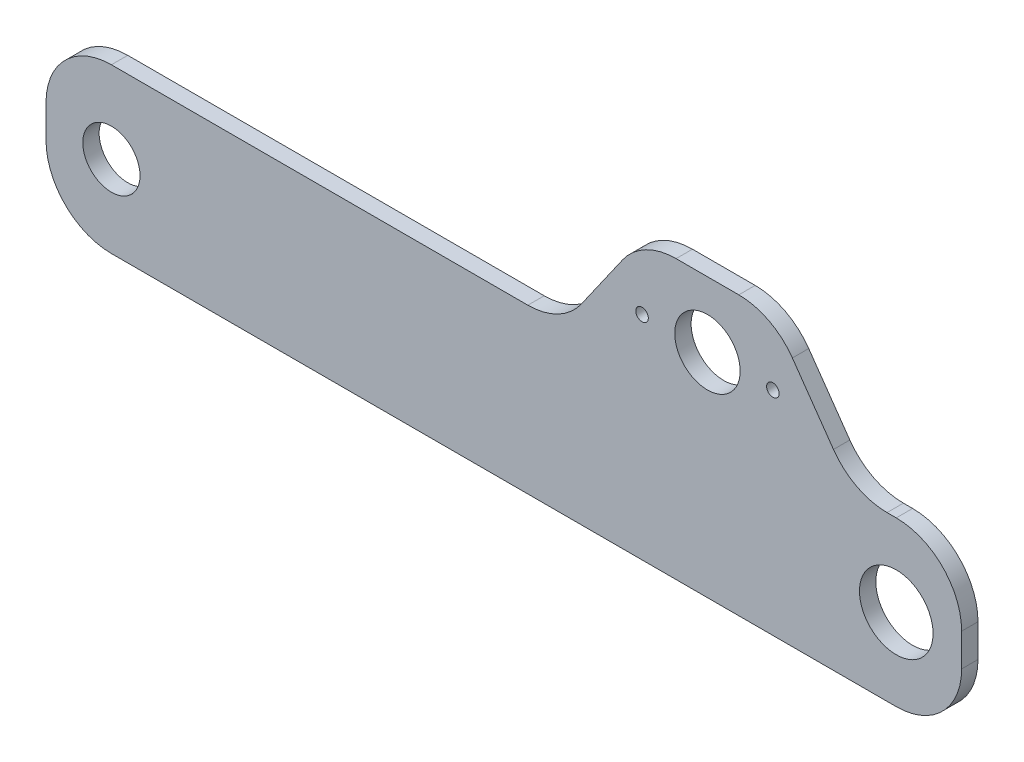
ISO-10303-21;
HEADER;
FILE_DESCRIPTION(('STEP AP214'),'2;1');
FILE_NAME('part.step','',(''),(''),'','','');
FILE_SCHEMA(('AUTOMOTIVE_DESIGN { 1 0 10303 214 1 1 1 1 }'));
ENDSEC;
DATA;
#1=APPLICATION_CONTEXT('core data for automotive mechanical design processes');
#2=APPLICATION_PROTOCOL_DEFINITION('international standard','automotive_design',2000,#1);
#3=PRODUCT_CONTEXT('',#1,'mechanical');
#4=PRODUCT('Part','Part','',(#3));
#5=PRODUCT_RELATED_PRODUCT_CATEGORY('part','',(#4));
#6=PRODUCT_DEFINITION_FORMATION('','',#4);
#7=PRODUCT_DEFINITION_CONTEXT('part definition',#1,'design');
#8=PRODUCT_DEFINITION('design','',#6,#7);
#9=PRODUCT_DEFINITION_SHAPE('','',#8);
#10=(LENGTH_UNIT() NAMED_UNIT(*) SI_UNIT(.MILLI.,.METRE.));
#11=(NAMED_UNIT(*) PLANE_ANGLE_UNIT() SI_UNIT($,.RADIAN.));
#12=(NAMED_UNIT(*) SI_UNIT($,.STERADIAN.) SOLID_ANGLE_UNIT());
#13=UNCERTAINTY_MEASURE_WITH_UNIT(LENGTH_MEASURE(1.E-05),#10,'distance_accuracy_value','');
#14=(GEOMETRIC_REPRESENTATION_CONTEXT(3) GLOBAL_UNCERTAINTY_ASSIGNED_CONTEXT((#13)) GLOBAL_UNIT_ASSIGNED_CONTEXT((#10,
#11,#12)) REPRESENTATION_CONTEXT('',''));
#15=CARTESIAN_POINT('',(0.,0.,0.));
#16=DIRECTION('',(0.,0.,1.));
#17=DIRECTION('',(1.,0.,0.));
#18=AXIS2_PLACEMENT_3D('',#15,#16,#17);
#19=CARTESIAN_POINT('',(341.76482123998,69.8499999999999,6.35));
#20=DIRECTION('',(0.,0.,1.));
#21=DIRECTION('',(1.,0.,0.));
#22=AXIS2_PLACEMENT_3D('',#19,#20,#21);
#23=PLANE('',#22);
#24=CARTESIAN_POINT('',(341.76482123998,76.2,6.35));
#25=DIRECTION('',(0.,0.,1.));
#26=DIRECTION('',(1.,0.,0.));
#27=AXIS2_PLACEMENT_3D('',#24,#25,#26);
#28=CIRCLE('',#27,14.2875);
#29=CARTESIAN_POINT('',(356.05232123998,76.2,6.35));
#30=VERTEX_POINT('',#29);
#31=EDGE_CURVE('E350',#30,#30,#28,.T.);
#32=ORIENTED_EDGE('',*,*,#31,.F.);
#33=EDGE_LOOP('',(#32));
#34=FACE_BOUND('',#33,.T.);
#35=CARTESIAN_POINT('',(36.9648212399797,76.2,6.35));
#36=DIRECTION('',(0.,0.,1.));
#37=DIRECTION('',(1.,0.,0.));
#38=AXIS2_PLACEMENT_3D('',#35,#36,#37);
#39=CIRCLE('',#38,11.1125);
#40=CARTESIAN_POINT('',(48.0773212399797,76.2,6.35));
#41=VERTEX_POINT('',#40);
#42=EDGE_CURVE('E362',#41,#41,#39,.T.);
#43=ORIENTED_EDGE('',*,*,#42,.F.);
#44=EDGE_LOOP('',(#43));
#45=FACE_BOUND('',#44,.T.);
#46=CARTESIAN_POINT('',(341.76482123998,69.8499999999999,6.35));
#47=DIRECTION('',(0.,0.,1.));
#48=DIRECTION('',(1.,0.,0.));
#49=AXIS2_PLACEMENT_3D('',#46,#47,#48);
#50=CIRCLE('',#49,25.4);
#51=CARTESIAN_POINT('',(341.764821239979,44.4499999999999,6.35));
#52=VERTEX_POINT('',#51);
#53=CARTESIAN_POINT('',(367.16482123998,69.8500000000001,6.35));
#54=VERTEX_POINT('',#53);
#55=EDGE_CURVE('E212',#52,#54,#50,.T.);
#56=ORIENTED_EDGE('',*,*,#55,.T.);
#57=DIRECTION('',(0.,1.,0.));
#58=VECTOR('',#57,1.);
#59=CARTESIAN_POINT('',(367.16482123998,69.8500000000001,6.35));
#60=LINE('',#59,#58);
#61=CARTESIAN_POINT('',(367.16482123998,82.5499999999998,6.35));
#62=VERTEX_POINT('',#61);
#63=EDGE_CURVE('E120',#54,#62,#60,.T.);
#64=ORIENTED_EDGE('',*,*,#63,.T.);
#65=CARTESIAN_POINT('',(341.76482123998,82.55,6.35));
#66=DIRECTION('',(0.,0.,1.));
#67=DIRECTION('',(-1.,0.,0.));
#68=AXIS2_PLACEMENT_3D('',#65,#66,#67);
#69=CIRCLE('',#68,25.4);
#70=CARTESIAN_POINT('',(341.764821239979,107.95,6.35));
#71=VERTEX_POINT('',#70);
#72=EDGE_CURVE('E251',#62,#71,#69,.T.);
#73=ORIENTED_EDGE('',*,*,#72,.T.);
#74=DIRECTION('',(-1.,0.,0.));
#75=VECTOR('',#74,1.);
#76=CARTESIAN_POINT('',(338.192123961331,107.95,6.35));
#77=LINE('',#76,#75);
#78=CARTESIAN_POINT('',(338.192123961331,107.95,6.35));
#79=VERTEX_POINT('',#78);
#80=EDGE_CURVE('E270',#71,#79,#77,.T.);
#81=ORIENTED_EDGE('',*,*,#80,.T.);
#82=CARTESIAN_POINT('',(338.192123961331,133.35,6.35));
#83=DIRECTION('',(0.,0.,-1.));
#84=DIRECTION('',(1.,0.,0.));
#85=AXIS2_PLACEMENT_3D('',#82,#83,#84);
#86=CIRCLE('',#85,25.4);
#87=CARTESIAN_POINT('',(317.38566203639,118.781158516684,6.35));
#88=VERTEX_POINT('',#87);
#89=EDGE_CURVE('E267',#79,#88,#86,.T.);
#90=ORIENTED_EDGE('',*,*,#89,.T.);
#91=DIRECTION('',(-0.573576436351044,0.819152044288993,0.));
#92=VECTOR('',#91,1.);
#93=CARTESIAN_POINT('',(301.429554644821,141.568841483316,6.35));
#94=LINE('',#93,#92);
#95=CARTESIAN_POINT('',(301.429554644821,141.568841483316,6.35));
#96=VERTEX_POINT('',#95);
#97=EDGE_CURVE('E269',#88,#96,#94,.T.);
#98=ORIENTED_EDGE('',*,*,#97,.T.);
#99=CARTESIAN_POINT('',(280.623092719881,127.,6.35));
#100=DIRECTION('',(0.,0.,1.));
#101=DIRECTION('',(-1.,0.,0.));
#102=AXIS2_PLACEMENT_3D('',#99,#100,#101);
#103=CIRCLE('',#102,25.4);
#104=CARTESIAN_POINT('',(280.623092719881,152.4,6.35));
#105=VERTEX_POINT('',#104);
#106=EDGE_CURVE('E272',#96,#105,#103,.T.);
#107=ORIENTED_EDGE('',*,*,#106,.T.);
#108=DIRECTION('',(-1.,0.,0.));
#109=VECTOR('',#108,1.);
#110=CARTESIAN_POINT('',(256.267898887909,152.4,6.35));
#111=LINE('',#110,#109);
#112=CARTESIAN_POINT('',(256.267898887909,152.4,6.35));
#113=VERTEX_POINT('',#112);
#114=EDGE_CURVE('E278',#105,#113,#111,.T.);
#115=ORIENTED_EDGE('',*,*,#114,.T.);
#116=CARTESIAN_POINT('',(256.267898887909,127.,6.35));
#117=DIRECTION('',(0.,0.,1.));
#118=DIRECTION('',(-1.,0.,0.));
#119=AXIS2_PLACEMENT_3D('',#116,#117,#118);
#120=CIRCLE('',#119,25.4);
#121=CARTESIAN_POINT('',(235.461436962969,141.568841483316,6.35));
#122=VERTEX_POINT('',#121);
#123=EDGE_CURVE('E280',#113,#122,#120,.T.);
#124=ORIENTED_EDGE('',*,*,#123,.T.);
#125=DIRECTION('',(-0.573576436351043,-0.819152044288994,0.));
#126=VECTOR('',#125,1.);
#127=CARTESIAN_POINT('',(219.5053295714,118.781158516684,6.35));
#128=LINE('',#127,#126);
#129=CARTESIAN_POINT('',(219.5053295714,118.781158516684,6.35));
#130=VERTEX_POINT('',#129);
#131=EDGE_CURVE('E282',#122,#130,#128,.T.);
#132=ORIENTED_EDGE('',*,*,#131,.T.);
#133=CARTESIAN_POINT('',(198.698867646459,133.35,6.35));
#134=DIRECTION('',(0.,0.,-1.));
#135=DIRECTION('',(-1.,0.,0.));
#136=AXIS2_PLACEMENT_3D('',#133,#134,#135);
#137=CIRCLE('',#136,25.4);
#138=CARTESIAN_POINT('',(198.698867646459,107.95,6.35));
#139=VERTEX_POINT('',#138);
#140=EDGE_CURVE('E284',#130,#139,#137,.T.);
#141=ORIENTED_EDGE('',*,*,#140,.T.);
#142=DIRECTION('',(-1.,0.,0.));
#143=VECTOR('',#142,1.);
#144=CARTESIAN_POINT('',(36.9648212399799,107.95,6.35));
#145=LINE('',#144,#143);
#146=CARTESIAN_POINT('',(36.9648212399799,107.95,6.35));
#147=VERTEX_POINT('',#146);
#148=EDGE_CURVE('E286',#139,#147,#145,.T.);
#149=ORIENTED_EDGE('',*,*,#148,.T.);
#150=CARTESIAN_POINT('',(36.9648212399797,82.55,6.35));
#151=DIRECTION('',(0.,0.,1.));
#152=DIRECTION('',(-1.,0.,0.));
#153=AXIS2_PLACEMENT_3D('',#150,#151,#152);
#154=CIRCLE('',#153,25.4);
#155=CARTESIAN_POINT('',(11.5648212399797,82.5499999999998,6.35));
#156=VERTEX_POINT('',#155);
#157=EDGE_CURVE('E163',#147,#156,#154,.T.);
#158=ORIENTED_EDGE('',*,*,#157,.T.);
#159=DIRECTION('',(0.,-1.,0.));
#160=VECTOR('',#159,1.);
#161=CARTESIAN_POINT('',(11.5648212399797,69.8500000000002,6.35));
#162=LINE('',#161,#160);
#163=CARTESIAN_POINT('',(11.5648212399797,69.85,6.35));
#164=VERTEX_POINT('',#163);
#165=EDGE_CURVE('E157',#156,#164,#162,.T.);
#166=ORIENTED_EDGE('',*,*,#165,.T.);
#167=CARTESIAN_POINT('',(36.9648212399797,69.85,6.35));
#168=DIRECTION('',(0.,0.,1.));
#169=DIRECTION('',(-1.,0.,0.));
#170=AXIS2_PLACEMENT_3D('',#167,#168,#169);
#171=CIRCLE('',#170,25.4);
#172=CARTESIAN_POINT('',(36.9648212399799,44.45,6.35));
#173=VERTEX_POINT('',#172);
#174=EDGE_CURVE('E161',#164,#173,#171,.T.);
#175=ORIENTED_EDGE('',*,*,#174,.T.);
#176=DIRECTION('',(1.,0.,0.));
#177=VECTOR('',#176,1.);
#178=CARTESIAN_POINT('',(36.9648212399799,44.45,6.35));
#179=LINE('',#178,#177);
#180=EDGE_CURVE('E53',#173,#52,#179,.T.);
#181=ORIENTED_EDGE('',*,*,#180,.T.);
#182=EDGE_LOOP('',(#56,#64,#73,#81,#90,#98,#107,#115,#124,#132,#141,#149,#158,#166,#175,#181));
#183=FACE_BOUND('',#182,.T.);
#184=CARTESIAN_POINT('',(243.045495803895,127.,6.35));
#185=DIRECTION('',(0.,0.,1.));
#186=DIRECTION('',(1.,0.,0.));
#187=AXIS2_PLACEMENT_3D('',#184,#185,#186);
#188=CIRCLE('',#187,2.43839999999994);
#189=CARTESIAN_POINT('',(245.483895803895,127.,6.35));
#190=VERTEX_POINT('',#189);
#191=EDGE_CURVE('E185',#190,#190,#188,.T.);
#192=ORIENTED_EDGE('',*,*,#191,.F.);
#193=EDGE_LOOP('',(#192));
#194=FACE_BOUND('',#193,.T.);
#195=CARTESIAN_POINT('',(293.845495803895,127.,6.35));
#196=DIRECTION('',(0.,0.,1.));
#197=DIRECTION('',(1.,0.,0.));
#198=AXIS2_PLACEMENT_3D('',#195,#196,#197);
#199=CIRCLE('',#198,2.4384);
#200=CARTESIAN_POINT('',(296.283895803895,127.,6.35));
#201=VERTEX_POINT('',#200);
#202=EDGE_CURVE('E356',#201,#201,#199,.T.);
#203=ORIENTED_EDGE('',*,*,#202,.F.);
#204=EDGE_LOOP('',(#203));
#205=FACE_BOUND('',#204,.T.);
#206=CARTESIAN_POINT('',(268.445495803895,127.,6.35));
#207=DIRECTION('',(0.,0.,1.));
#208=DIRECTION('',(1.,0.,0.));
#209=AXIS2_PLACEMENT_3D('',#206,#207,#208);
#210=CIRCLE('',#209,12.7);
#211=CARTESIAN_POINT('',(281.145495803895,127.,6.35));
#212=VERTEX_POINT('',#211);
#213=EDGE_CURVE('E341',#212,#212,#210,.T.);
#214=ORIENTED_EDGE('',*,*,#213,.F.);
#215=EDGE_LOOP('',(#214));
#216=FACE_BOUND('',#215,.T.);
#217=ADVANCED_FACE('F36',(#34,#45,#183,#194,#205,#216),#23,.T.);
#218=CARTESIAN_POINT('',(341.76482123998,69.8499999999999,0.));
#219=DIRECTION('',(0.,0.,1.));
#220=DIRECTION('',(1.,0.,0.));
#221=AXIS2_PLACEMENT_3D('',#218,#219,#220);
#222=PLANE('',#221);
#223=CARTESIAN_POINT('',(341.76482123998,69.8499999999999,0.));
#224=DIRECTION('',(0.,0.,1.));
#225=DIRECTION('',(1.,0.,0.));
#226=AXIS2_PLACEMENT_3D('',#223,#224,#225);
#227=CIRCLE('',#226,25.4);
#228=CARTESIAN_POINT('',(341.764821239979,44.4499999999999,0.));
#229=VERTEX_POINT('',#228);
#230=CARTESIAN_POINT('',(367.16482123998,69.8500000000001,0.));
#231=VERTEX_POINT('',#230);
#232=EDGE_CURVE('E181',#229,#231,#227,.T.);
#233=ORIENTED_EDGE('',*,*,#232,.F.);
#234=DIRECTION('',(1.,0.,0.));
#235=VECTOR('',#234,1.);
#236=CARTESIAN_POINT('',(36.9648212399799,44.45,0.));
#237=LINE('',#236,#235);
#238=CARTESIAN_POINT('',(36.9648212399799,44.45,0.));
#239=VERTEX_POINT('',#238);
#240=EDGE_CURVE('E112',#239,#229,#237,.T.);
#241=ORIENTED_EDGE('',*,*,#240,.F.);
#242=CARTESIAN_POINT('',(36.9648212399797,69.85,0.));
#243=DIRECTION('',(0.,0.,1.));
#244=DIRECTION('',(-1.,0.,0.));
#245=AXIS2_PLACEMENT_3D('',#242,#243,#244);
#246=CIRCLE('',#245,25.4);
#247=CARTESIAN_POINT('',(11.5648212399797,69.85,0.));
#248=VERTEX_POINT('',#247);
#249=EDGE_CURVE('E106',#248,#239,#246,.T.);
#250=ORIENTED_EDGE('',*,*,#249,.F.);
#251=DIRECTION('',(0.,-1.,0.));
#252=VECTOR('',#251,1.);
#253=CARTESIAN_POINT('',(11.5648212399797,69.8500000000002,0.));
#254=LINE('',#253,#252);
#255=CARTESIAN_POINT('',(11.5648212399797,82.5499999999998,0.));
#256=VERTEX_POINT('',#255);
#257=EDGE_CURVE('E171',#256,#248,#254,.T.);
#258=ORIENTED_EDGE('',*,*,#257,.F.);
#259=CARTESIAN_POINT('',(36.9648212399797,82.55,0.));
#260=DIRECTION('',(0.,0.,1.));
#261=DIRECTION('',(-1.,0.,0.));
#262=AXIS2_PLACEMENT_3D('',#259,#260,#261);
#263=CIRCLE('',#262,25.4);
#264=CARTESIAN_POINT('',(36.9648212399799,107.95,0.));
#265=VERTEX_POINT('',#264);
#266=EDGE_CURVE('E207',#265,#256,#263,.T.);
#267=ORIENTED_EDGE('',*,*,#266,.F.);
#268=DIRECTION('',(-1.,0.,0.));
#269=VECTOR('',#268,1.);
#270=CARTESIAN_POINT('',(36.9648212399799,107.95,0.));
#271=LINE('',#270,#269);
#272=CARTESIAN_POINT('',(198.698867646459,107.95,0.));
#273=VERTEX_POINT('',#272);
#274=EDGE_CURVE('E205',#273,#265,#271,.T.);
#275=ORIENTED_EDGE('',*,*,#274,.F.);
#276=CARTESIAN_POINT('',(198.698867646459,133.35,0.));
#277=DIRECTION('',(0.,0.,-1.));
#278=DIRECTION('',(-1.,0.,0.));
#279=AXIS2_PLACEMENT_3D('',#276,#277,#278);
#280=CIRCLE('',#279,25.4);
#281=CARTESIAN_POINT('',(219.5053295714,118.781158516684,0.));
#282=VERTEX_POINT('',#281);
#283=EDGE_CURVE('E203',#282,#273,#280,.T.);
#284=ORIENTED_EDGE('',*,*,#283,.F.);
#285=DIRECTION('',(-0.573576436351043,-0.819152044288994,0.));
#286=VECTOR('',#285,1.);
#287=CARTESIAN_POINT('',(219.5053295714,118.781158516684,0.));
#288=LINE('',#287,#286);
#289=CARTESIAN_POINT('',(235.461436962969,141.568841483316,0.));
#290=VERTEX_POINT('',#289);
#291=EDGE_CURVE('E201',#290,#282,#288,.T.);
#292=ORIENTED_EDGE('',*,*,#291,.F.);
#293=CARTESIAN_POINT('',(256.267898887909,127.,0.));
#294=DIRECTION('',(0.,0.,1.));
#295=DIRECTION('',(-1.,0.,0.));
#296=AXIS2_PLACEMENT_3D('',#293,#294,#295);
#297=CIRCLE('',#296,25.4);
#298=CARTESIAN_POINT('',(256.267898887909,152.4,0.));
#299=VERTEX_POINT('',#298);
#300=EDGE_CURVE('E199',#299,#290,#297,.T.);
#301=ORIENTED_EDGE('',*,*,#300,.F.);
#302=DIRECTION('',(-1.,0.,0.));
#303=VECTOR('',#302,1.);
#304=CARTESIAN_POINT('',(256.267898887909,152.4,0.));
#305=LINE('',#304,#303);
#306=CARTESIAN_POINT('',(280.623092719881,152.4,0.));
#307=VERTEX_POINT('',#306);
#308=EDGE_CURVE('E197',#307,#299,#305,.T.);
#309=ORIENTED_EDGE('',*,*,#308,.F.);
#310=CARTESIAN_POINT('',(280.623092719881,127.,0.));
#311=DIRECTION('',(0.,0.,1.));
#312=DIRECTION('',(-1.,0.,0.));
#313=AXIS2_PLACEMENT_3D('',#310,#311,#312);
#314=CIRCLE('',#313,25.4);
#315=CARTESIAN_POINT('',(301.429554644821,141.568841483316,0.));
#316=VERTEX_POINT('',#315);
#317=EDGE_CURVE('E195',#316,#307,#314,.T.);
#318=ORIENTED_EDGE('',*,*,#317,.F.);
#319=DIRECTION('',(-0.573576436351044,0.819152044288993,0.));
#320=VECTOR('',#319,1.);
#321=CARTESIAN_POINT('',(301.429554644821,141.568841483316,0.));
#322=LINE('',#321,#320);
#323=CARTESIAN_POINT('',(317.38566203639,118.781158516684,0.));
#324=VERTEX_POINT('',#323);
#325=EDGE_CURVE('E193',#324,#316,#322,.T.);
#326=ORIENTED_EDGE('',*,*,#325,.F.);
#327=CARTESIAN_POINT('',(338.192123961331,133.35,0.));
#328=DIRECTION('',(0.,0.,-1.));
#329=DIRECTION('',(1.,0.,0.));
#330=AXIS2_PLACEMENT_3D('',#327,#328,#329);
#331=CIRCLE('',#330,25.4);
#332=CARTESIAN_POINT('',(338.192123961331,107.95,0.));
#333=VERTEX_POINT('',#332);
#334=EDGE_CURVE('E191',#333,#324,#331,.T.);
#335=ORIENTED_EDGE('',*,*,#334,.F.);
#336=DIRECTION('',(-1.,0.,0.));
#337=VECTOR('',#336,1.);
#338=CARTESIAN_POINT('',(338.192123961331,107.95,0.));
#339=LINE('',#338,#337);
#340=CARTESIAN_POINT('',(341.764821239979,107.95,0.));
#341=VERTEX_POINT('',#340);
#342=EDGE_CURVE('E189',#341,#333,#339,.T.);
#343=ORIENTED_EDGE('',*,*,#342,.F.);
#344=CARTESIAN_POINT('',(341.76482123998,82.55,0.));
#345=DIRECTION('',(0.,0.,1.));
#346=DIRECTION('',(-1.,0.,0.));
#347=AXIS2_PLACEMENT_3D('',#344,#345,#346);
#348=CIRCLE('',#347,25.4);
#349=CARTESIAN_POINT('',(367.16482123998,82.5499999999998,0.));
#350=VERTEX_POINT('',#349);
#351=EDGE_CURVE('E187',#350,#341,#348,.T.);
#352=ORIENTED_EDGE('',*,*,#351,.F.);
#353=DIRECTION('',(0.,1.,0.));
#354=VECTOR('',#353,1.);
#355=CARTESIAN_POINT('',(367.16482123998,69.8500000000001,0.));
#356=LINE('',#355,#354);
#357=EDGE_CURVE('E184',#231,#350,#356,.T.);
#358=ORIENTED_EDGE('',*,*,#357,.F.);
#359=EDGE_LOOP('',(#233,#241,#250,#258,#267,#275,#284,#292,#301,#309,#318,#326,#335,#343,#352,#358));
#360=FACE_BOUND('',#359,.T.);
#361=CARTESIAN_POINT('',(243.045495803895,127.,0.));
#362=DIRECTION('',(0.,0.,1.));
#363=DIRECTION('',(1.,0.,0.));
#364=AXIS2_PLACEMENT_3D('',#361,#362,#363);
#365=CIRCLE('',#364,2.43839999999994);
#366=CARTESIAN_POINT('',(245.483895803895,127.,0.));
#367=VERTEX_POINT('',#366);
#368=EDGE_CURVE('E365',#367,#367,#365,.T.);
#369=ORIENTED_EDGE('',*,*,#368,.T.);
#370=EDGE_LOOP('',(#369));
#371=FACE_BOUND('',#370,.T.);
#372=CARTESIAN_POINT('',(36.9648212399797,76.2,0.));
#373=DIRECTION('',(0.,0.,1.));
#374=DIRECTION('',(1.,0.,0.));
#375=AXIS2_PLACEMENT_3D('',#372,#373,#374);
#376=CIRCLE('',#375,11.1125);
#377=CARTESIAN_POINT('',(48.0773212399797,76.2,0.));
#378=VERTEX_POINT('',#377);
#379=EDGE_CURVE('E359',#378,#378,#376,.T.);
#380=ORIENTED_EDGE('',*,*,#379,.T.);
#381=EDGE_LOOP('',(#380));
#382=FACE_BOUND('',#381,.T.);
#383=CARTESIAN_POINT('',(293.845495803895,127.,0.));
#384=DIRECTION('',(0.,0.,1.));
#385=DIRECTION('',(1.,0.,0.));
#386=AXIS2_PLACEMENT_3D('',#383,#384,#385);
#387=CIRCLE('',#386,2.4384);
#388=CARTESIAN_POINT('',(296.283895803895,127.,0.));
#389=VERTEX_POINT('',#388);
#390=EDGE_CURVE('E353',#389,#389,#387,.T.);
#391=ORIENTED_EDGE('',*,*,#390,.T.);
#392=EDGE_LOOP('',(#391));
#393=FACE_BOUND('',#392,.T.);
#394=CARTESIAN_POINT('',(341.76482123998,76.2,0.));
#395=DIRECTION('',(0.,0.,1.));
#396=DIRECTION('',(1.,0.,0.));
#397=AXIS2_PLACEMENT_3D('',#394,#395,#396);
#398=CIRCLE('',#397,14.2875);
#399=CARTESIAN_POINT('',(356.05232123998,76.2,0.));
#400=VERTEX_POINT('',#399);
#401=EDGE_CURVE('E347',#400,#400,#398,.T.);
#402=ORIENTED_EDGE('',*,*,#401,.T.);
#403=EDGE_LOOP('',(#402));
#404=FACE_BOUND('',#403,.T.);
#405=CARTESIAN_POINT('',(268.445495803895,127.,0.));
#406=DIRECTION('',(0.,0.,1.));
#407=DIRECTION('',(1.,0.,0.));
#408=AXIS2_PLACEMENT_3D('',#405,#406,#407);
#409=CIRCLE('',#408,12.7);
#410=CARTESIAN_POINT('',(281.145495803895,127.,0.));
#411=VERTEX_POINT('',#410);
#412=EDGE_CURVE('E344',#411,#411,#409,.T.);
#413=ORIENTED_EDGE('',*,*,#412,.T.);
#414=EDGE_LOOP('',(#413));
#415=FACE_BOUND('',#414,.T.);
#416=ADVANCED_FACE('F255',(#360,#371,#382,#393,#404,#415),#222,.F.);
#417=CARTESIAN_POINT('',(341.76482123998,69.8499999999999,6.35));
#418=DIRECTION('',(0.,0.,-1.));
#419=DIRECTION('',(-1.,0.,0.));
#420=AXIS2_PLACEMENT_3D('',#417,#418,#419);
#421=CYLINDRICAL_SURFACE('',#420,25.4);
#422=ORIENTED_EDGE('',*,*,#232,.T.);
#423=DIRECTION('',(0.,0.,-1.));
#424=VECTOR('',#423,1.);
#425=CARTESIAN_POINT('',(367.16482123998,69.8500000000001,6.35));
#426=LINE('',#425,#424);
#427=EDGE_CURVE('E11',#54,#231,#426,.T.);
#428=ORIENTED_EDGE('',*,*,#427,.F.);
#429=ORIENTED_EDGE('',*,*,#55,.F.);
#430=DIRECTION('',(0.,0.,-1.));
#431=VECTOR('',#430,1.);
#432=CARTESIAN_POINT('',(341.764821239979,44.4499999999999,6.35));
#433=LINE('',#432,#431);
#434=EDGE_CURVE('E177',#52,#229,#433,.T.);
#435=ORIENTED_EDGE('',*,*,#434,.T.);
#436=EDGE_LOOP('',(#422,#428,#429,#435));
#437=FACE_BOUND('',#436,.T.);
#438=ADVANCED_FACE('F38',(#437),#421,.T.);
#439=CARTESIAN_POINT('',(367.16482123998,69.8500000000001,6.35));
#440=DIRECTION('',(-1.,0.,0.));
#441=DIRECTION('',(0.,0.,1.));
#442=AXIS2_PLACEMENT_3D('',#439,#440,#441);
#443=PLANE('',#442);
#444=ORIENTED_EDGE('',*,*,#357,.T.);
#445=DIRECTION('',(0.,0.,-1.));
#446=VECTOR('',#445,1.);
#447=CARTESIAN_POINT('',(367.16482123998,82.5499999999998,6.35));
#448=LINE('',#447,#446);
#449=EDGE_CURVE('E45',#62,#350,#448,.T.);
#450=ORIENTED_EDGE('',*,*,#449,.F.);
#451=ORIENTED_EDGE('',*,*,#63,.F.);
#452=ORIENTED_EDGE('',*,*,#427,.T.);
#453=EDGE_LOOP('',(#444,#450,#451,#452));
#454=FACE_BOUND('',#453,.T.);
#455=ADVANCED_FACE('F524',(#454),#443,.F.);
#456=CARTESIAN_POINT('',(341.76482123998,82.55,6.35));
#457=DIRECTION('',(0.,0.,-1.));
#458=DIRECTION('',(-1.,0.,0.));
#459=AXIS2_PLACEMENT_3D('',#456,#457,#458);
#460=CYLINDRICAL_SURFACE('',#459,25.4);
#461=ORIENTED_EDGE('',*,*,#351,.T.);
#462=DIRECTION('',(0.,0.,-1.));
#463=VECTOR('',#462,1.);
#464=CARTESIAN_POINT('',(341.764821239979,107.95,6.35));
#465=LINE('',#464,#463);
#466=EDGE_CURVE('E243',#71,#341,#465,.T.);
#467=ORIENTED_EDGE('',*,*,#466,.F.);
#468=ORIENTED_EDGE('',*,*,#72,.F.);
#469=ORIENTED_EDGE('',*,*,#449,.T.);
#470=EDGE_LOOP('',(#461,#467,#468,#469));
#471=FACE_BOUND('',#470,.T.);
#472=ADVANCED_FACE('F249',(#471),#460,.T.);
#473=CARTESIAN_POINT('',(338.192123961331,107.95,6.35));
#474=DIRECTION('',(0.,-1.,0.));
#475=DIRECTION('',(0.,0.,-1.));
#476=AXIS2_PLACEMENT_3D('',#473,#474,#475);
#477=PLANE('',#476);
#478=ORIENTED_EDGE('',*,*,#342,.T.);
#479=DIRECTION('',(0.,0.,-1.));
#480=VECTOR('',#479,1.);
#481=CARTESIAN_POINT('',(338.192123961331,107.95,6.35));
#482=LINE('',#481,#480);
#483=EDGE_CURVE('E240',#79,#333,#482,.T.);
#484=ORIENTED_EDGE('',*,*,#483,.F.);
#485=ORIENTED_EDGE('',*,*,#80,.F.);
#486=ORIENTED_EDGE('',*,*,#466,.T.);
#487=EDGE_LOOP('',(#478,#484,#485,#486));
#488=FACE_BOUND('',#487,.T.);
#489=ADVANCED_FACE('F261',(#488),#477,.F.);
#490=CARTESIAN_POINT('',(338.192123961331,133.35,6.35));
#491=DIRECTION('',(0.,0.,-1.));
#492=DIRECTION('',(-1.,0.,0.));
#493=AXIS2_PLACEMENT_3D('',#490,#491,#492);
#494=CYLINDRICAL_SURFACE('',#493,25.4);
#495=ORIENTED_EDGE('',*,*,#334,.T.);
#496=DIRECTION('',(0.,0.,-1.));
#497=VECTOR('',#496,1.);
#498=CARTESIAN_POINT('',(317.38566203639,118.781158516684,6.35));
#499=LINE('',#498,#497);
#500=EDGE_CURVE('E237',#88,#324,#499,.T.);
#501=ORIENTED_EDGE('',*,*,#500,.F.);
#502=ORIENTED_EDGE('',*,*,#89,.F.);
#503=ORIENTED_EDGE('',*,*,#483,.T.);
#504=EDGE_LOOP('',(#495,#501,#502,#503));
#505=FACE_BOUND('',#504,.T.);
#506=ADVANCED_FACE('F265',(#505),#494,.F.);
#507=CARTESIAN_POINT('',(301.429554644821,141.568841483316,6.35));
#508=DIRECTION('',(-0.819152044288993,-0.573576436351044,0.));
#509=DIRECTION('',(0.573576436351044,-0.819152044288993,0.));
#510=AXIS2_PLACEMENT_3D('',#507,#508,#509);
#511=PLANE('',#510);
#512=ORIENTED_EDGE('',*,*,#325,.T.);
#513=DIRECTION('',(0.,0.,-1.));
#514=VECTOR('',#513,1.);
#515=CARTESIAN_POINT('',(301.429554644821,141.568841483316,6.35));
#516=LINE('',#515,#514);
#517=EDGE_CURVE('E234',#96,#316,#516,.T.);
#518=ORIENTED_EDGE('',*,*,#517,.F.);
#519=ORIENTED_EDGE('',*,*,#97,.F.);
#520=ORIENTED_EDGE('',*,*,#500,.T.);
#521=EDGE_LOOP('',(#512,#518,#519,#520));
#522=FACE_BOUND('',#521,.T.);
#523=ADVANCED_FACE('F489',(#522),#511,.F.);
#524=CARTESIAN_POINT('',(280.623092719881,127.,6.35));
#525=DIRECTION('',(0.,0.,-1.));
#526=DIRECTION('',(-1.,0.,0.));
#527=AXIS2_PLACEMENT_3D('',#524,#525,#526);
#528=CYLINDRICAL_SURFACE('',#527,25.4);
#529=ORIENTED_EDGE('',*,*,#317,.T.);
#530=DIRECTION('',(0.,0.,-1.));
#531=VECTOR('',#530,1.);
#532=CARTESIAN_POINT('',(280.623092719881,152.4,6.35));
#533=LINE('',#532,#531);
#534=EDGE_CURVE('E231',#105,#307,#533,.T.);
#535=ORIENTED_EDGE('',*,*,#534,.F.);
#536=ORIENTED_EDGE('',*,*,#106,.F.);
#537=ORIENTED_EDGE('',*,*,#517,.T.);
#538=EDGE_LOOP('',(#529,#535,#536,#537));
#539=FACE_BOUND('',#538,.T.);
#540=ADVANCED_FACE('F479',(#539),#528,.T.);
#541=CARTESIAN_POINT('',(256.267898887909,152.4,6.35));
#542=DIRECTION('',(0.,-1.,0.));
#543=DIRECTION('',(0.,0.,-1.));
#544=AXIS2_PLACEMENT_3D('',#541,#542,#543);
#545=PLANE('',#544);
#546=ORIENTED_EDGE('',*,*,#308,.T.);
#547=DIRECTION('',(0.,0.,-1.));
#548=VECTOR('',#547,1.);
#549=CARTESIAN_POINT('',(256.267898887909,152.4,6.35));
#550=LINE('',#549,#548);
#551=EDGE_CURVE('E228',#113,#299,#550,.T.);
#552=ORIENTED_EDGE('',*,*,#551,.F.);
#553=ORIENTED_EDGE('',*,*,#114,.F.);
#554=ORIENTED_EDGE('',*,*,#534,.T.);
#555=EDGE_LOOP('',(#546,#552,#553,#554));
#556=FACE_BOUND('',#555,.T.);
#557=ADVANCED_FACE('F469',(#556),#545,.F.);
#558=CARTESIAN_POINT('',(256.267898887909,127.,6.35));
#559=DIRECTION('',(0.,0.,-1.));
#560=DIRECTION('',(-1.,0.,0.));
#561=AXIS2_PLACEMENT_3D('',#558,#559,#560);
#562=CYLINDRICAL_SURFACE('',#561,25.4);
#563=ORIENTED_EDGE('',*,*,#300,.T.);
#564=DIRECTION('',(0.,0.,-1.));
#565=VECTOR('',#564,1.);
#566=CARTESIAN_POINT('',(235.461436962969,141.568841483316,6.35));
#567=LINE('',#566,#565);
#568=EDGE_CURVE('E225',#122,#290,#567,.T.);
#569=ORIENTED_EDGE('',*,*,#568,.F.);
#570=ORIENTED_EDGE('',*,*,#123,.F.);
#571=ORIENTED_EDGE('',*,*,#551,.T.);
#572=EDGE_LOOP('',(#563,#569,#570,#571));
#573=FACE_BOUND('',#572,.T.);
#574=ADVANCED_FACE('F459',(#573),#562,.T.);
#575=CARTESIAN_POINT('',(219.5053295714,118.781158516684,6.35));
#576=DIRECTION('',(0.819152044288994,-0.573576436351043,0.));
#577=DIRECTION('',(0.573576436351043,0.819152044288994,0.));
#578=AXIS2_PLACEMENT_3D('',#575,#576,#577);
#579=PLANE('',#578);
#580=ORIENTED_EDGE('',*,*,#291,.T.);
#581=DIRECTION('',(0.,0.,-1.));
#582=VECTOR('',#581,1.);
#583=CARTESIAN_POINT('',(219.5053295714,118.781158516684,6.35));
#584=LINE('',#583,#582);
#585=EDGE_CURVE('E222',#130,#282,#584,.T.);
#586=ORIENTED_EDGE('',*,*,#585,.F.);
#587=ORIENTED_EDGE('',*,*,#131,.F.);
#588=ORIENTED_EDGE('',*,*,#568,.T.);
#589=EDGE_LOOP('',(#580,#586,#587,#588));
#590=FACE_BOUND('',#589,.T.);
#591=ADVANCED_FACE('F449',(#590),#579,.F.);
#592=CARTESIAN_POINT('',(198.698867646459,133.35,6.35));
#593=DIRECTION('',(0.,0.,-1.));
#594=DIRECTION('',(-1.,0.,0.));
#595=AXIS2_PLACEMENT_3D('',#592,#593,#594);
#596=CYLINDRICAL_SURFACE('',#595,25.4);
#597=ORIENTED_EDGE('',*,*,#283,.T.);
#598=DIRECTION('',(0.,0.,-1.));
#599=VECTOR('',#598,1.);
#600=CARTESIAN_POINT('',(198.698867646459,107.95,6.35));
#601=LINE('',#600,#599);
#602=EDGE_CURVE('E219',#139,#273,#601,.T.);
#603=ORIENTED_EDGE('',*,*,#602,.F.);
#604=ORIENTED_EDGE('',*,*,#140,.F.);
#605=ORIENTED_EDGE('',*,*,#585,.T.);
#606=EDGE_LOOP('',(#597,#603,#604,#605));
#607=FACE_BOUND('',#606,.T.);
#608=ADVANCED_FACE('F440',(#607),#596,.F.);
#609=CARTESIAN_POINT('',(36.9648212399799,107.95,6.35));
#610=DIRECTION('',(0.,-1.,0.));
#611=DIRECTION('',(1.,0.,0.));
#612=AXIS2_PLACEMENT_3D('',#609,#610,#611);
#613=PLANE('',#612);
#614=ORIENTED_EDGE('',*,*,#274,.T.);
#615=DIRECTION('',(0.,0.,-1.));
#616=VECTOR('',#615,1.);
#617=CARTESIAN_POINT('',(36.9648212399799,107.95,6.35));
#618=LINE('',#617,#616);
#619=EDGE_CURVE('E216',#147,#265,#618,.T.);
#620=ORIENTED_EDGE('',*,*,#619,.F.);
#621=ORIENTED_EDGE('',*,*,#148,.F.);
#622=ORIENTED_EDGE('',*,*,#602,.T.);
#623=EDGE_LOOP('',(#614,#620,#621,#622));
#624=FACE_BOUND('',#623,.T.);
#625=ADVANCED_FACE('F292',(#624),#613,.F.);
#626=CARTESIAN_POINT('',(36.9648212399797,82.55,6.35));
#627=DIRECTION('',(0.,0.,-1.));
#628=DIRECTION('',(-1.,0.,0.));
#629=AXIS2_PLACEMENT_3D('',#626,#627,#628);
#630=CYLINDRICAL_SURFACE('',#629,25.4);
#631=ORIENTED_EDGE('',*,*,#266,.T.);
#632=DIRECTION('',(0.,0.,-1.));
#633=VECTOR('',#632,1.);
#634=CARTESIAN_POINT('',(11.5648212399797,82.5499999999998,6.35));
#635=LINE('',#634,#633);
#636=EDGE_CURVE('E172',#156,#256,#635,.T.);
#637=ORIENTED_EDGE('',*,*,#636,.F.);
#638=ORIENTED_EDGE('',*,*,#157,.F.);
#639=ORIENTED_EDGE('',*,*,#619,.T.);
#640=EDGE_LOOP('',(#631,#637,#638,#639));
#641=FACE_BOUND('',#640,.T.);
#642=ADVANCED_FACE('F296',(#641),#630,.T.);
#643=CARTESIAN_POINT('',(11.5648212399797,69.8500000000002,6.35));
#644=DIRECTION('',(1.,0.,0.));
#645=DIRECTION('',(0.,0.,-1.));
#646=AXIS2_PLACEMENT_3D('',#643,#644,#645);
#647=PLANE('',#646);
#648=ORIENTED_EDGE('',*,*,#257,.T.);
#649=DIRECTION('',(0.,0.,-1.));
#650=VECTOR('',#649,1.);
#651=CARTESIAN_POINT('',(11.5648212399797,69.85,6.35));
#652=LINE('',#651,#650);
#653=EDGE_CURVE('E168',#164,#248,#652,.T.);
#654=ORIENTED_EDGE('',*,*,#653,.F.);
#655=ORIENTED_EDGE('',*,*,#165,.F.);
#656=ORIENTED_EDGE('',*,*,#636,.T.);
#657=EDGE_LOOP('',(#648,#654,#655,#656));
#658=FACE_BOUND('',#657,.T.);
#659=ADVANCED_FACE('F169',(#658),#647,.F.);
#660=CARTESIAN_POINT('',(36.9648212399797,69.85,6.35));
#661=DIRECTION('',(0.,0.,-1.));
#662=DIRECTION('',(-1.,0.,0.));
#663=AXIS2_PLACEMENT_3D('',#660,#661,#662);
#664=CYLINDRICAL_SURFACE('',#663,25.4);
#665=ORIENTED_EDGE('',*,*,#249,.T.);
#666=DIRECTION('',(0.,0.,-1.));
#667=VECTOR('',#666,1.);
#668=CARTESIAN_POINT('',(36.9648212399799,44.45,6.35));
#669=LINE('',#668,#667);
#670=EDGE_CURVE('E173',#173,#239,#669,.T.);
#671=ORIENTED_EDGE('',*,*,#670,.F.);
#672=ORIENTED_EDGE('',*,*,#174,.F.);
#673=ORIENTED_EDGE('',*,*,#653,.T.);
#674=EDGE_LOOP('',(#665,#671,#672,#673));
#675=FACE_BOUND('',#674,.T.);
#676=ADVANCED_FACE('F175',(#675),#664,.T.);
#677=CARTESIAN_POINT('',(36.9648212399799,44.45,6.35));
#678=DIRECTION('',(0.,1.,0.));
#679=DIRECTION('',(-1.,0.,0.));
#680=AXIS2_PLACEMENT_3D('',#677,#678,#679);
#681=PLANE('',#680);
#682=ORIENTED_EDGE('',*,*,#240,.T.);
#683=ORIENTED_EDGE('',*,*,#434,.F.);
#684=ORIENTED_EDGE('',*,*,#180,.F.);
#685=ORIENTED_EDGE('',*,*,#670,.T.);
#686=EDGE_LOOP('',(#682,#683,#684,#685));
#687=FACE_BOUND('',#686,.T.);
#688=ADVANCED_FACE('F300',(#687),#681,.F.);
#689=CARTESIAN_POINT('',(243.045495803895,127.,6.35));
#690=DIRECTION('',(0.,0.,-1.));
#691=DIRECTION('',(-1.,0.,0.));
#692=AXIS2_PLACEMENT_3D('',#689,#690,#691);
#693=CYLINDRICAL_SURFACE('',#692,2.43839999999994);
#694=ORIENTED_EDGE('',*,*,#191,.T.);
#695=EDGE_LOOP('',(#694));
#696=FACE_BOUND('',#695,.T.);
#697=ORIENTED_EDGE('',*,*,#368,.F.);
#698=EDGE_LOOP('',(#697));
#699=FACE_BOUND('',#698,.T.);
#700=ADVANCED_FACE('F302',(#696,#699),#693,.F.);
#701=CARTESIAN_POINT('',(36.9648212399797,76.2,6.35));
#702=DIRECTION('',(0.,0.,-1.));
#703=DIRECTION('',(-1.,0.,0.));
#704=AXIS2_PLACEMENT_3D('',#701,#702,#703);
#705=CYLINDRICAL_SURFACE('',#704,11.1125);
#706=ORIENTED_EDGE('',*,*,#42,.T.);
#707=EDGE_LOOP('',(#706));
#708=FACE_BOUND('',#707,.T.);
#709=ORIENTED_EDGE('',*,*,#379,.F.);
#710=EDGE_LOOP('',(#709));
#711=FACE_BOUND('',#710,.T.);
#712=ADVANCED_FACE('F308',(#708,#711),#705,.F.);
#713=CARTESIAN_POINT('',(293.845495803895,127.,6.35));
#714=DIRECTION('',(0.,0.,-1.));
#715=DIRECTION('',(-1.,0.,0.));
#716=AXIS2_PLACEMENT_3D('',#713,#714,#715);
#717=CYLINDRICAL_SURFACE('',#716,2.4384);
#718=ORIENTED_EDGE('',*,*,#202,.T.);
#719=EDGE_LOOP('',(#718));
#720=FACE_BOUND('',#719,.T.);
#721=ORIENTED_EDGE('',*,*,#390,.F.);
#722=EDGE_LOOP('',(#721));
#723=FACE_BOUND('',#722,.T.);
#724=ADVANCED_FACE('F324',(#720,#723),#717,.F.);
#725=CARTESIAN_POINT('',(341.76482123998,76.2,6.35));
#726=DIRECTION('',(0.,0.,-1.));
#727=DIRECTION('',(-1.,0.,0.));
#728=AXIS2_PLACEMENT_3D('',#725,#726,#727);
#729=CYLINDRICAL_SURFACE('',#728,14.2875);
#730=ORIENTED_EDGE('',*,*,#31,.T.);
#731=EDGE_LOOP('',(#730));
#732=FACE_BOUND('',#731,.T.);
#733=ORIENTED_EDGE('',*,*,#401,.F.);
#734=EDGE_LOOP('',(#733));
#735=FACE_BOUND('',#734,.T.);
#736=ADVANCED_FACE('F328',(#732,#735),#729,.F.);
#737=CARTESIAN_POINT('',(268.445495803895,127.,6.35));
#738=DIRECTION('',(0.,0.,-1.));
#739=DIRECTION('',(-1.,0.,0.));
#740=AXIS2_PLACEMENT_3D('',#737,#738,#739);
#741=CYLINDRICAL_SURFACE('',#740,12.7);
#742=ORIENTED_EDGE('',*,*,#213,.T.);
#743=EDGE_LOOP('',(#742));
#744=FACE_BOUND('',#743,.T.);
#745=ORIENTED_EDGE('',*,*,#412,.F.);
#746=EDGE_LOOP('',(#745));
#747=FACE_BOUND('',#746,.T.);
#748=ADVANCED_FACE('F332',(#744,#747),#741,.F.);
#749=CLOSED_SHELL('',(#217,#416,#438,#455,#472,#489,#506,#523,#540,#557,#574,#591,#608,#625,
#642,#659,#676,#688,#700,#712,#724,#736,#748));
#750=MANIFOLD_SOLID_BREP('B2',#749);
#751=ADVANCED_BREP_SHAPE_REPRESENTATION('',(#18,#750),#14);
#752=SHAPE_DEFINITION_REPRESENTATION(#9,#751);
ENDSEC;
END-ISO-10303-21;
